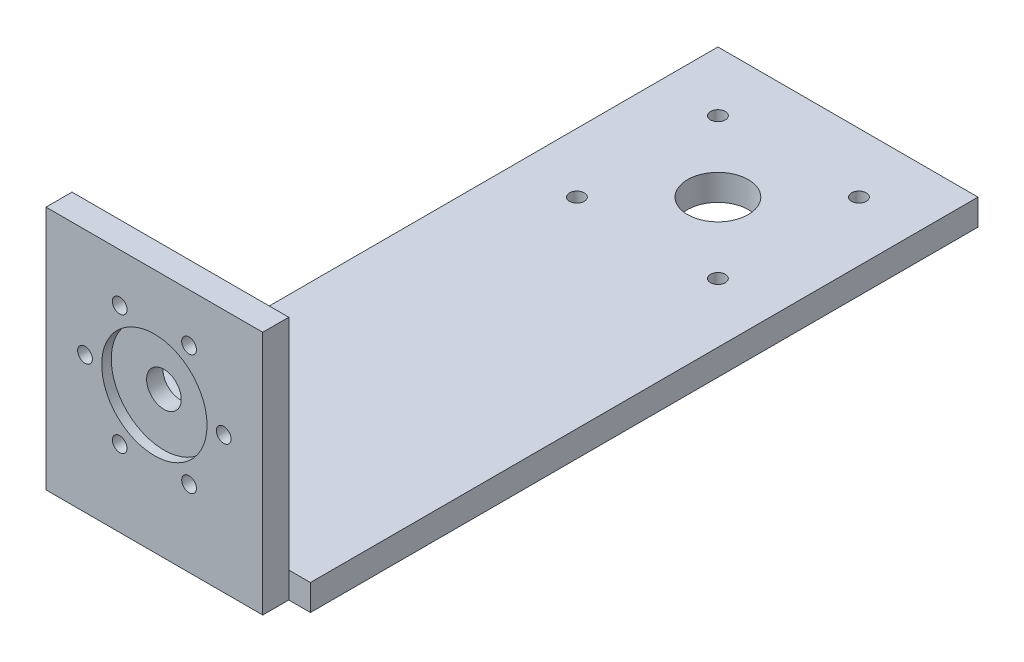
ISO-10303-21;
HEADER;
FILE_DESCRIPTION(('STEP AP214'),'2;1');
FILE_NAME('part.step','',(''),(''),'','','');
FILE_SCHEMA(('AUTOMOTIVE_DESIGN { 1 0 10303 214 1 1 1 1 }'));
ENDSEC;
DATA;
#1=APPLICATION_CONTEXT('core data for automotive mechanical design processes');
#2=APPLICATION_PROTOCOL_DEFINITION('international standard','automotive_design',2000,#1);
#3=PRODUCT_CONTEXT('',#1,'mechanical');
#4=PRODUCT('Part','Part','',(#3));
#5=PRODUCT_RELATED_PRODUCT_CATEGORY('part','',(#4));
#6=PRODUCT_DEFINITION_FORMATION('','',#4);
#7=PRODUCT_DEFINITION_CONTEXT('part definition',#1,'design');
#8=PRODUCT_DEFINITION('design','',#6,#7);
#9=PRODUCT_DEFINITION_SHAPE('','',#8);
#10=(LENGTH_UNIT() NAMED_UNIT(*) SI_UNIT(.MILLI.,.METRE.));
#11=(NAMED_UNIT(*) PLANE_ANGLE_UNIT() SI_UNIT($,.RADIAN.));
#12=(NAMED_UNIT(*) SI_UNIT($,.STERADIAN.) SOLID_ANGLE_UNIT());
#13=UNCERTAINTY_MEASURE_WITH_UNIT(LENGTH_MEASURE(1.E-05),#10,'distance_accuracy_value','');
#14=(GEOMETRIC_REPRESENTATION_CONTEXT(3) GLOBAL_UNCERTAINTY_ASSIGNED_CONTEXT((#13)) GLOBAL_UNIT_ASSIGNED_CONTEXT((#10,
#11,#12)) REPRESENTATION_CONTEXT('',''));
#15=CARTESIAN_POINT('',(0.,0.,0.));
#16=DIRECTION('',(0.,0.,1.));
#17=DIRECTION('',(1.,0.,0.));
#18=AXIS2_PLACEMENT_3D('',#15,#16,#17);
#19=CARTESIAN_POINT('',(0.,0.,-6.));
#20=DIRECTION('',(0.,0.,1.));
#21=DIRECTION('',(1.,0.,0.));
#22=AXIS2_PLACEMENT_3D('',#19,#20,#21);
#23=PLANE('',#22);
#24=CARTESIAN_POINT('',(0.,0.,-6.));
#25=DIRECTION('',(0.,0.,1.));
#26=DIRECTION('',(1.,0.,0.));
#27=AXIS2_PLACEMENT_3D('',#24,#25,#26);
#28=CIRCLE('',#27,4.);
#29=CARTESIAN_POINT('',(4.,0.,-6.));
#30=VERTEX_POINT('',#29);
#31=EDGE_CURVE('E161',#30,#30,#28,.T.);
#32=ORIENTED_EDGE('',*,*,#31,.T.);
#33=EDGE_LOOP('',(#32));
#34=FACE_BOUND('',#33,.T.);
#35=CARTESIAN_POINT('',(8.,-13.856406460551,-6.));
#36=DIRECTION('',(0.,0.,1.));
#37=DIRECTION('',(1.,0.,0.));
#38=AXIS2_PLACEMENT_3D('',#35,#36,#37);
#39=CIRCLE('',#38,1.7);
#40=CARTESIAN_POINT('',(9.7,-13.856406460551,-6.));
#41=VERTEX_POINT('',#40);
#42=EDGE_CURVE('E163',#41,#41,#39,.T.);
#43=ORIENTED_EDGE('',*,*,#42,.T.);
#44=EDGE_LOOP('',(#43));
#45=FACE_BOUND('',#44,.T.);
#46=CARTESIAN_POINT('',(-8.00000000000001,-13.856406460551,-6.));
#47=DIRECTION('',(0.,0.,1.));
#48=DIRECTION('',(1.,0.,0.));
#49=AXIS2_PLACEMENT_3D('',#46,#47,#48);
#50=CIRCLE('',#49,1.7);
#51=CARTESIAN_POINT('',(-6.30000000000001,-13.856406460551,-6.));
#52=VERTEX_POINT('',#51);
#53=EDGE_CURVE('E169',#52,#52,#50,.T.);
#54=ORIENTED_EDGE('',*,*,#53,.T.);
#55=EDGE_LOOP('',(#54));
#56=FACE_BOUND('',#55,.T.);
#57=CARTESIAN_POINT('',(-16.,0.,-6.));
#58=DIRECTION('',(0.,0.,1.));
#59=DIRECTION('',(1.,0.,0.));
#60=AXIS2_PLACEMENT_3D('',#57,#58,#59);
#61=CIRCLE('',#60,1.7);
#62=CARTESIAN_POINT('',(-14.3,0.,-6.));
#63=VERTEX_POINT('',#62);
#64=EDGE_CURVE('E173',#63,#63,#61,.T.);
#65=ORIENTED_EDGE('',*,*,#64,.T.);
#66=EDGE_LOOP('',(#65));
#67=FACE_BOUND('',#66,.T.);
#68=CARTESIAN_POINT('',(-8.,13.856406460551,-6.));
#69=DIRECTION('',(0.,0.,1.));
#70=DIRECTION('',(1.,0.,0.));
#71=AXIS2_PLACEMENT_3D('',#68,#69,#70);
#72=CIRCLE('',#71,1.7);
#73=CARTESIAN_POINT('',(-6.3,13.856406460551,-6.));
#74=VERTEX_POINT('',#73);
#75=EDGE_CURVE('E178',#74,#74,#72,.T.);
#76=ORIENTED_EDGE('',*,*,#75,.T.);
#77=EDGE_LOOP('',(#76));
#78=FACE_BOUND('',#77,.T.);
#79=CARTESIAN_POINT('',(8.,13.856406460551,-6.));
#80=DIRECTION('',(0.,0.,1.));
#81=DIRECTION('',(1.,0.,0.));
#82=AXIS2_PLACEMENT_3D('',#79,#80,#81);
#83=CIRCLE('',#82,1.7);
#84=CARTESIAN_POINT('',(9.7,13.856406460551,-6.));
#85=VERTEX_POINT('',#84);
#86=EDGE_CURVE('E189',#85,#85,#83,.T.);
#87=ORIENTED_EDGE('',*,*,#86,.T.);
#88=EDGE_LOOP('',(#87));
#89=FACE_BOUND('',#88,.T.);
#90=CARTESIAN_POINT('',(16.,0.,-6.));
#91=DIRECTION('',(0.,0.,1.));
#92=DIRECTION('',(1.,0.,0.));
#93=AXIS2_PLACEMENT_3D('',#90,#91,#92);
#94=CIRCLE('',#93,1.7);
#95=CARTESIAN_POINT('',(17.7,0.,-6.));
#96=VERTEX_POINT('',#95);
#97=EDGE_CURVE('E195',#96,#96,#94,.T.);
#98=ORIENTED_EDGE('',*,*,#97,.T.);
#99=EDGE_LOOP('',(#98));
#100=FACE_BOUND('',#99,.T.);
#101=DIRECTION('',(1.,0.,0.));
#102=VECTOR('',#101,1.);
#103=CARTESIAN_POINT('',(-30.,-25.5,-6.));
#104=LINE('',#103,#102);
#105=CARTESIAN_POINT('',(-25.,-25.5,-6.));
#106=VERTEX_POINT('',#105);
#107=CARTESIAN_POINT('',(25.,-25.5,-6.));
#108=VERTEX_POINT('',#107);
#109=EDGE_CURVE('E11',#106,#108,#104,.T.);
#110=ORIENTED_EDGE('',*,*,#109,.F.);
#111=DIRECTION('',(0.,-1.,0.));
#112=VECTOR('',#111,1.);
#113=CARTESIAN_POINT('',(-25.,25.,-6.));
#114=LINE('',#113,#112);
#115=CARTESIAN_POINT('',(-25.,25.,-6.));
#116=VERTEX_POINT('',#115);
#117=EDGE_CURVE('E210',#116,#106,#114,.T.);
#118=ORIENTED_EDGE('',*,*,#117,.F.);
#119=DIRECTION('',(-1.,0.,0.));
#120=VECTOR('',#119,1.);
#121=CARTESIAN_POINT('',(25.,25.,-6.));
#122=LINE('',#121,#120);
#123=CARTESIAN_POINT('',(25.,25.,-6.));
#124=VERTEX_POINT('',#123);
#125=EDGE_CURVE('E88',#124,#116,#122,.T.);
#126=ORIENTED_EDGE('',*,*,#125,.F.);
#127=DIRECTION('',(0.,1.,0.));
#128=VECTOR('',#127,1.);
#129=CARTESIAN_POINT('',(25.,-31.5,-6.));
#130=LINE('',#129,#128);
#131=EDGE_CURVE('E207',#108,#124,#130,.T.);
#132=ORIENTED_EDGE('',*,*,#131,.F.);
#133=EDGE_LOOP('',(#110,#118,#126,#132));
#134=FACE_BOUND('',#133,.T.);
#135=ADVANCED_FACE('F39',(#34,#45,#56,#67,#78,#89,#100,#134),#23,.F.);
#136=CARTESIAN_POINT('',(0.,0.,0.));
#137=DIRECTION('',(0.,0.,-1.));
#138=DIRECTION('',(-1.,0.,0.));
#139=AXIS2_PLACEMENT_3D('',#136,#137,#138);
#140=CYLINDRICAL_SURFACE('',#139,4.);
#141=ORIENTED_EDGE('',*,*,#31,.F.);
#142=EDGE_LOOP('',(#141));
#143=FACE_BOUND('',#142,.T.);
#144=CARTESIAN_POINT('',(0.,0.,-2.2));
#145=DIRECTION('',(0.,0.,1.));
#146=DIRECTION('',(1.,0.,0.));
#147=AXIS2_PLACEMENT_3D('',#144,#145,#146);
#148=CIRCLE('',#147,4.);
#149=CARTESIAN_POINT('',(4.,0.,-2.2));
#150=VERTEX_POINT('',#149);
#151=EDGE_CURVE('E43',#150,#150,#148,.T.);
#152=ORIENTED_EDGE('',*,*,#151,.T.);
#153=EDGE_LOOP('',(#152));
#154=FACE_BOUND('',#153,.T.);
#155=ADVANCED_FACE('F278',(#143,#154),#140,.F.);
#156=CARTESIAN_POINT('',(0.,0.,0.));
#157=DIRECTION('',(0.,0.,1.));
#158=DIRECTION('',(1.,0.,0.));
#159=AXIS2_PLACEMENT_3D('',#156,#157,#158);
#160=PLANE('',#159);
#161=CARTESIAN_POINT('',(0.,0.,0.));
#162=DIRECTION('',(0.,0.,1.));
#163=DIRECTION('',(1.,0.,0.));
#164=AXIS2_PLACEMENT_3D('',#161,#162,#163);
#165=CIRCLE('',#164,12.15);
#166=CARTESIAN_POINT('',(12.15,0.,0.));
#167=VERTEX_POINT('',#166);
#168=EDGE_CURVE('E146',#167,#167,#165,.T.);
#169=ORIENTED_EDGE('',*,*,#168,.F.);
#170=EDGE_LOOP('',(#169));
#171=FACE_BOUND('',#170,.T.);
#172=CARTESIAN_POINT('',(8.,-13.856406460551,0.));
#173=DIRECTION('',(0.,0.,1.));
#174=DIRECTION('',(1.,0.,0.));
#175=AXIS2_PLACEMENT_3D('',#172,#173,#174);
#176=CIRCLE('',#175,1.7);
#177=CARTESIAN_POINT('',(9.7,-13.856406460551,0.));
#178=VERTEX_POINT('',#177);
#179=EDGE_CURVE('E164',#178,#178,#176,.T.);
#180=ORIENTED_EDGE('',*,*,#179,.F.);
#181=EDGE_LOOP('',(#180));
#182=FACE_BOUND('',#181,.T.);
#183=CARTESIAN_POINT('',(-16.,0.,0.));
#184=DIRECTION('',(0.,0.,1.));
#185=DIRECTION('',(1.,0.,0.));
#186=AXIS2_PLACEMENT_3D('',#183,#184,#185);
#187=CIRCLE('',#186,1.7);
#188=CARTESIAN_POINT('',(-14.3,0.,0.));
#189=VERTEX_POINT('',#188);
#190=EDGE_CURVE('E180',#189,#189,#187,.T.);
#191=ORIENTED_EDGE('',*,*,#190,.F.);
#192=EDGE_LOOP('',(#191));
#193=FACE_BOUND('',#192,.T.);
#194=CARTESIAN_POINT('',(8.,13.856406460551,0.));
#195=DIRECTION('',(0.,0.,1.));
#196=DIRECTION('',(1.,0.,0.));
#197=AXIS2_PLACEMENT_3D('',#194,#195,#196);
#198=CIRCLE('',#197,1.7);
#199=CARTESIAN_POINT('',(9.7,13.856406460551,0.));
#200=VERTEX_POINT('',#199);
#201=EDGE_CURVE('E188',#200,#200,#198,.T.);
#202=ORIENTED_EDGE('',*,*,#201,.F.);
#203=EDGE_LOOP('',(#202));
#204=FACE_BOUND('',#203,.T.);
#205=DIRECTION('',(0.,-1.,0.));
#206=VECTOR('',#205,1.);
#207=CARTESIAN_POINT('',(-25.,25.,0.));
#208=LINE('',#207,#206);
#209=CARTESIAN_POINT('',(-25.,25.,0.));
#210=VERTEX_POINT('',#209);
#211=CARTESIAN_POINT('',(-25.,-31.5,0.));
#212=VERTEX_POINT('',#211);
#213=EDGE_CURVE('E199',#210,#212,#208,.T.);
#214=ORIENTED_EDGE('',*,*,#213,.T.);
#215=DIRECTION('',(1.,0.,0.));
#216=VECTOR('',#215,1.);
#217=CARTESIAN_POINT('',(-25.,-31.5,0.));
#218=LINE('',#217,#216);
#219=CARTESIAN_POINT('',(25.,-31.5,0.));
#220=VERTEX_POINT('',#219);
#221=EDGE_CURVE('E94',#212,#220,#218,.T.);
#222=ORIENTED_EDGE('',*,*,#221,.T.);
#223=DIRECTION('',(0.,1.,0.));
#224=VECTOR('',#223,1.);
#225=CARTESIAN_POINT('',(25.,-31.5,0.));
#226=LINE('',#225,#224);
#227=CARTESIAN_POINT('',(25.,25.,0.));
#228=VERTEX_POINT('',#227);
#229=EDGE_CURVE('E201',#220,#228,#226,.T.);
#230=ORIENTED_EDGE('',*,*,#229,.T.);
#231=DIRECTION('',(-1.,0.,0.));
#232=VECTOR('',#231,1.);
#233=CARTESIAN_POINT('',(25.,25.,0.));
#234=LINE('',#233,#232);
#235=EDGE_CURVE('E62',#228,#210,#234,.T.);
#236=ORIENTED_EDGE('',*,*,#235,.T.);
#237=EDGE_LOOP('',(#214,#222,#230,#236));
#238=FACE_BOUND('',#237,.T.);
#239=CARTESIAN_POINT('',(16.,0.,0.));
#240=DIRECTION('',(0.,0.,1.));
#241=DIRECTION('',(1.,0.,0.));
#242=AXIS2_PLACEMENT_3D('',#239,#240,#241);
#243=CIRCLE('',#242,1.7);
#244=CARTESIAN_POINT('',(17.7,0.,0.));
#245=VERTEX_POINT('',#244);
#246=EDGE_CURVE('E193',#245,#245,#243,.T.);
#247=ORIENTED_EDGE('',*,*,#246,.F.);
#248=EDGE_LOOP('',(#247));
#249=FACE_BOUND('',#248,.T.);
#250=CARTESIAN_POINT('',(-8.,13.856406460551,0.));
#251=DIRECTION('',(0.,0.,1.));
#252=DIRECTION('',(1.,0.,0.));
#253=AXIS2_PLACEMENT_3D('',#250,#251,#252);
#254=CIRCLE('',#253,1.7);
#255=CARTESIAN_POINT('',(-6.3,13.856406460551,0.));
#256=VERTEX_POINT('',#255);
#257=EDGE_CURVE('E181',#256,#256,#254,.T.);
#258=ORIENTED_EDGE('',*,*,#257,.F.);
#259=EDGE_LOOP('',(#258));
#260=FACE_BOUND('',#259,.T.);
#261=CARTESIAN_POINT('',(-8.00000000000001,-13.856406460551,0.));
#262=DIRECTION('',(0.,0.,1.));
#263=DIRECTION('',(1.,0.,0.));
#264=AXIS2_PLACEMENT_3D('',#261,#262,#263);
#265=CIRCLE('',#264,1.7);
#266=CARTESIAN_POINT('',(-6.30000000000001,-13.856406460551,0.));
#267=VERTEX_POINT('',#266);
#268=EDGE_CURVE('E174',#267,#267,#265,.T.);
#269=ORIENTED_EDGE('',*,*,#268,.F.);
#270=EDGE_LOOP('',(#269));
#271=FACE_BOUND('',#270,.T.);
#272=ADVANCED_FACE('F262',(#171,#182,#193,#204,#238,#249,#260,#271),#160,.T.);
#273=CARTESIAN_POINT('',(-25.,25.,0.));
#274=DIRECTION('',(1.,0.,0.));
#275=DIRECTION('',(0.,0.,-1.));
#276=AXIS2_PLACEMENT_3D('',#273,#274,#275);
#277=PLANE('',#276);
#278=ORIENTED_EDGE('',*,*,#117,.T.);
#279=CARTESIAN_POINT('',(-25.,-31.5,-6.));
#280=VERTEX_POINT('',#279);
#281=EDGE_CURVE('E134',#106,#280,#114,.T.);
#282=ORIENTED_EDGE('',*,*,#281,.T.);
#283=DIRECTION('',(0.,0.,-1.));
#284=VECTOR('',#283,1.);
#285=CARTESIAN_POINT('',(-25.,-31.5,0.));
#286=LINE('',#285,#284);
#287=EDGE_CURVE('E48',#212,#280,#286,.T.);
#288=ORIENTED_EDGE('',*,*,#287,.F.);
#289=ORIENTED_EDGE('',*,*,#213,.F.);
#290=DIRECTION('',(0.,0.,-1.));
#291=VECTOR('',#290,1.);
#292=CARTESIAN_POINT('',(-25.,25.,0.));
#293=LINE('',#292,#291);
#294=EDGE_CURVE('E206',#210,#116,#293,.T.);
#295=ORIENTED_EDGE('',*,*,#294,.T.);
#296=EDGE_LOOP('',(#278,#282,#288,#289,#295));
#297=FACE_BOUND('',#296,.T.);
#298=ADVANCED_FACE('F41',(#297),#277,.F.);
#299=CARTESIAN_POINT('',(-25.,-31.5,0.));
#300=DIRECTION('',(0.,1.,0.));
#301=DIRECTION('',(0.,0.,1.));
#302=AXIS2_PLACEMENT_3D('',#299,#300,#301);
#303=PLANE('',#302);
#304=ORIENTED_EDGE('',*,*,#287,.T.);
#305=DIRECTION('',(1.,0.,0.));
#306=VECTOR('',#305,1.);
#307=CARTESIAN_POINT('',(-30.,-31.5,-6.));
#308=LINE('',#307,#306);
#309=CARTESIAN_POINT('',(-30.,-31.5,-6.));
#310=VERTEX_POINT('',#309);
#311=EDGE_CURVE('E219',#310,#280,#308,.T.);
#312=ORIENTED_EDGE('',*,*,#311,.F.);
#313=DIRECTION('',(0.,0.,1.));
#314=VECTOR('',#313,1.);
#315=CARTESIAN_POINT('',(-30.,-31.5,-160.));
#316=LINE('',#315,#314);
#317=CARTESIAN_POINT('',(-30.,-31.5,-160.));
#318=VERTEX_POINT('',#317);
#319=EDGE_CURVE('E150',#318,#310,#316,.T.);
#320=ORIENTED_EDGE('',*,*,#319,.F.);
#321=DIRECTION('',(-1.,0.,0.));
#322=VECTOR('',#321,1.);
#323=CARTESIAN_POINT('',(30.,-31.5,-160.));
#324=LINE('',#323,#322);
#325=CARTESIAN_POINT('',(30.,-31.5,-160.));
#326=VERTEX_POINT('',#325);
#327=EDGE_CURVE('E141',#326,#318,#324,.T.);
#328=ORIENTED_EDGE('',*,*,#327,.F.);
#329=DIRECTION('',(0.,0.,-1.));
#330=VECTOR('',#329,1.);
#331=CARTESIAN_POINT('',(30.,-31.5,-6.));
#332=LINE('',#331,#330);
#333=CARTESIAN_POINT('',(30.,-31.5,-6.));
#334=VERTEX_POINT('',#333);
#335=EDGE_CURVE('E224',#334,#326,#332,.T.);
#336=ORIENTED_EDGE('',*,*,#335,.F.);
#337=CARTESIAN_POINT('',(25.,-31.5,-6.));
#338=VERTEX_POINT('',#337);
#339=EDGE_CURVE('E221',#338,#334,#308,.T.);
#340=ORIENTED_EDGE('',*,*,#339,.F.);
#341=DIRECTION('',(0.,0.,-1.));
#342=VECTOR('',#341,1.);
#343=CARTESIAN_POINT('',(25.,-31.5,0.));
#344=LINE('',#343,#342);
#345=EDGE_CURVE('E216',#220,#338,#344,.T.);
#346=ORIENTED_EDGE('',*,*,#345,.F.);
#347=ORIENTED_EDGE('',*,*,#221,.F.);
#348=EDGE_LOOP('',(#304,#312,#320,#328,#336,#340,#346,#347));
#349=FACE_BOUND('',#348,.T.);
#350=CARTESIAN_POINT('',(16.2634559672906,-31.5,-146.263455967291));
#351=DIRECTION('',(0.,1.,0.));
#352=DIRECTION('',(0.,0.,1.));
#353=AXIS2_PLACEMENT_3D('',#350,#351,#352);
#354=CIRCLE('',#353,1.7);
#355=CARTESIAN_POINT('',(16.2634559672906,-31.5,-144.563455967291));
#356=VERTEX_POINT('',#355);
#357=EDGE_CURVE('E245',#356,#356,#354,.T.);
#358=ORIENTED_EDGE('',*,*,#357,.T.);
#359=EDGE_LOOP('',(#358));
#360=FACE_BOUND('',#359,.T.);
#361=CARTESIAN_POINT('',(-16.2634559672906,-31.5,-146.263455967291));
#362=DIRECTION('',(0.,1.,0.));
#363=DIRECTION('',(0.,0.,1.));
#364=AXIS2_PLACEMENT_3D('',#361,#362,#363);
#365=CIRCLE('',#364,1.7);
#366=CARTESIAN_POINT('',(-16.2634559672906,-31.5,-144.563455967291));
#367=VERTEX_POINT('',#366);
#368=EDGE_CURVE('E253',#367,#367,#365,.T.);
#369=ORIENTED_EDGE('',*,*,#368,.T.);
#370=EDGE_LOOP('',(#369));
#371=FACE_BOUND('',#370,.T.);
#372=CARTESIAN_POINT('',(-16.2634559672906,-31.5,-113.736544032709));
#373=DIRECTION('',(0.,1.,0.));
#374=DIRECTION('',(0.,0.,1.));
#375=AXIS2_PLACEMENT_3D('',#372,#373,#374);
#376=CIRCLE('',#375,1.7);
#377=CARTESIAN_POINT('',(-16.2634559672906,-31.5,-112.036544032709));
#378=VERTEX_POINT('',#377);
#379=EDGE_CURVE('E368',#378,#378,#376,.T.);
#380=ORIENTED_EDGE('',*,*,#379,.T.);
#381=EDGE_LOOP('',(#380));
#382=FACE_BOUND('',#381,.T.);
#383=CARTESIAN_POINT('',(16.2634559672906,-31.5,-113.736544032709));
#384=DIRECTION('',(0.,1.,0.));
#385=DIRECTION('',(0.,0.,1.));
#386=AXIS2_PLACEMENT_3D('',#383,#384,#385);
#387=CIRCLE('',#386,1.7);
#388=CARTESIAN_POINT('',(16.2634559672906,-31.5,-112.036544032709));
#389=VERTEX_POINT('',#388);
#390=EDGE_CURVE('E358',#389,#389,#387,.T.);
#391=ORIENTED_EDGE('',*,*,#390,.T.);
#392=EDGE_LOOP('',(#391));
#393=FACE_BOUND('',#392,.T.);
#394=CARTESIAN_POINT('',(0.,-31.5,-130.));
#395=DIRECTION('',(0.,1.,0.));
#396=DIRECTION('',(0.,0.,1.));
#397=AXIS2_PLACEMENT_3D('',#394,#395,#396);
#398=CIRCLE('',#397,7.);
#399=CARTESIAN_POINT('',(0.,-31.5,-123.));
#400=VERTEX_POINT('',#399);
#401=EDGE_CURVE('E360',#400,#400,#398,.T.);
#402=ORIENTED_EDGE('',*,*,#401,.T.);
#403=EDGE_LOOP('',(#402));
#404=FACE_BOUND('',#403,.T.);
#405=ADVANCED_FACE('F217',(#349,#360,#371,#382,#393,#404),#303,.F.);
#406=CARTESIAN_POINT('',(25.,-31.5,0.));
#407=DIRECTION('',(-1.,0.,0.));
#408=DIRECTION('',(0.,0.,1.));
#409=AXIS2_PLACEMENT_3D('',#406,#407,#408);
#410=PLANE('',#409);
#411=EDGE_CURVE('E209',#338,#108,#130,.T.);
#412=ORIENTED_EDGE('',*,*,#411,.T.);
#413=ORIENTED_EDGE('',*,*,#131,.T.);
#414=DIRECTION('',(0.,0.,-1.));
#415=VECTOR('',#414,1.);
#416=CARTESIAN_POINT('',(25.,25.,0.));
#417=LINE('',#416,#415);
#418=EDGE_CURVE('E212',#228,#124,#417,.T.);
#419=ORIENTED_EDGE('',*,*,#418,.F.);
#420=ORIENTED_EDGE('',*,*,#229,.F.);
#421=ORIENTED_EDGE('',*,*,#345,.T.);
#422=EDGE_LOOP('',(#412,#413,#419,#420,#421));
#423=FACE_BOUND('',#422,.T.);
#424=ADVANCED_FACE('F263',(#423),#410,.F.);
#425=CARTESIAN_POINT('',(25.,25.,0.));
#426=DIRECTION('',(0.,-1.,0.));
#427=DIRECTION('',(0.,0.,-1.));
#428=AXIS2_PLACEMENT_3D('',#425,#426,#427);
#429=PLANE('',#428);
#430=ORIENTED_EDGE('',*,*,#125,.T.);
#431=ORIENTED_EDGE('',*,*,#294,.F.);
#432=ORIENTED_EDGE('',*,*,#235,.F.);
#433=ORIENTED_EDGE('',*,*,#418,.T.);
#434=EDGE_LOOP('',(#430,#431,#432,#433));
#435=FACE_BOUND('',#434,.T.);
#436=ADVANCED_FACE('F266',(#435),#429,.F.);
#437=CARTESIAN_POINT('',(16.,0.,0.));
#438=DIRECTION('',(0.,0.,-1.));
#439=DIRECTION('',(-1.,0.,0.));
#440=AXIS2_PLACEMENT_3D('',#437,#438,#439);
#441=CYLINDRICAL_SURFACE('',#440,1.7);
#442=ORIENTED_EDGE('',*,*,#246,.T.);
#443=EDGE_LOOP('',(#442));
#444=FACE_BOUND('',#443,.T.);
#445=ORIENTED_EDGE('',*,*,#97,.F.);
#446=EDGE_LOOP('',(#445));
#447=FACE_BOUND('',#446,.T.);
#448=ADVANCED_FACE('F268',(#444,#447),#441,.F.);
#449=CARTESIAN_POINT('',(8.,13.856406460551,0.));
#450=DIRECTION('',(0.,0.,-1.));
#451=DIRECTION('',(-1.,0.,0.));
#452=AXIS2_PLACEMENT_3D('',#449,#450,#451);
#453=CYLINDRICAL_SURFACE('',#452,1.7);
#454=ORIENTED_EDGE('',*,*,#201,.T.);
#455=EDGE_LOOP('',(#454));
#456=FACE_BOUND('',#455,.T.);
#457=ORIENTED_EDGE('',*,*,#86,.F.);
#458=EDGE_LOOP('',(#457));
#459=FACE_BOUND('',#458,.T.);
#460=ADVANCED_FACE('F272',(#456,#459),#453,.F.);
#461=CARTESIAN_POINT('',(-8.,13.856406460551,0.));
#462=DIRECTION('',(0.,0.,-1.));
#463=DIRECTION('',(-1.,0.,0.));
#464=AXIS2_PLACEMENT_3D('',#461,#462,#463);
#465=CYLINDRICAL_SURFACE('',#464,1.7);
#466=ORIENTED_EDGE('',*,*,#257,.T.);
#467=EDGE_LOOP('',(#466));
#468=FACE_BOUND('',#467,.T.);
#469=ORIENTED_EDGE('',*,*,#75,.F.);
#470=EDGE_LOOP('',(#469));
#471=FACE_BOUND('',#470,.T.);
#472=ADVANCED_FACE('F299',(#468,#471),#465,.F.);
#473=CARTESIAN_POINT('',(-16.,0.,0.));
#474=DIRECTION('',(0.,0.,-1.));
#475=DIRECTION('',(-1.,0.,0.));
#476=AXIS2_PLACEMENT_3D('',#473,#474,#475);
#477=CYLINDRICAL_SURFACE('',#476,1.7);
#478=ORIENTED_EDGE('',*,*,#190,.T.);
#479=EDGE_LOOP('',(#478));
#480=FACE_BOUND('',#479,.T.);
#481=ORIENTED_EDGE('',*,*,#64,.F.);
#482=EDGE_LOOP('',(#481));
#483=FACE_BOUND('',#482,.T.);
#484=ADVANCED_FACE('F297',(#480,#483),#477,.F.);
#485=CARTESIAN_POINT('',(-8.00000000000001,-13.856406460551,0.));
#486=DIRECTION('',(0.,0.,-1.));
#487=DIRECTION('',(-1.,0.,0.));
#488=AXIS2_PLACEMENT_3D('',#485,#486,#487);
#489=CYLINDRICAL_SURFACE('',#488,1.7);
#490=ORIENTED_EDGE('',*,*,#268,.T.);
#491=EDGE_LOOP('',(#490));
#492=FACE_BOUND('',#491,.T.);
#493=ORIENTED_EDGE('',*,*,#53,.F.);
#494=EDGE_LOOP('',(#493));
#495=FACE_BOUND('',#494,.T.);
#496=ADVANCED_FACE('F301',(#492,#495),#489,.F.);
#497=CARTESIAN_POINT('',(8.,-13.856406460551,0.));
#498=DIRECTION('',(0.,0.,-1.));
#499=DIRECTION('',(-1.,0.,0.));
#500=AXIS2_PLACEMENT_3D('',#497,#498,#499);
#501=CYLINDRICAL_SURFACE('',#500,1.7);
#502=ORIENTED_EDGE('',*,*,#179,.T.);
#503=EDGE_LOOP('',(#502));
#504=FACE_BOUND('',#503,.T.);
#505=ORIENTED_EDGE('',*,*,#42,.F.);
#506=EDGE_LOOP('',(#505));
#507=FACE_BOUND('',#506,.T.);
#508=ADVANCED_FACE('F306',(#504,#507),#501,.F.);
#509=CARTESIAN_POINT('',(0.,0.,-2.2));
#510=DIRECTION('',(0.,0.,1.));
#511=DIRECTION('',(1.,0.,0.));
#512=AXIS2_PLACEMENT_3D('',#509,#510,#511);
#513=CYLINDRICAL_SURFACE('',#512,12.15);
#514=CARTESIAN_POINT('',(0.,0.,-2.2));
#515=DIRECTION('',(0.,0.,1.));
#516=DIRECTION('',(1.,0.,0.));
#517=AXIS2_PLACEMENT_3D('',#514,#515,#516);
#518=CIRCLE('',#517,12.15);
#519=CARTESIAN_POINT('',(12.15,0.,-2.2));
#520=VERTEX_POINT('',#519);
#521=EDGE_CURVE('E155',#520,#520,#518,.T.);
#522=ORIENTED_EDGE('',*,*,#521,.F.);
#523=EDGE_LOOP('',(#522));
#524=FACE_BOUND('',#523,.T.);
#525=ORIENTED_EDGE('',*,*,#168,.T.);
#526=EDGE_LOOP('',(#525));
#527=FACE_BOUND('',#526,.T.);
#528=ADVANCED_FACE('F313',(#524,#527),#513,.F.);
#529=CARTESIAN_POINT('',(0.,0.,-2.2));
#530=DIRECTION('',(0.,0.,1.));
#531=DIRECTION('',(1.,0.,0.));
#532=AXIS2_PLACEMENT_3D('',#529,#530,#531);
#533=PLANE('',#532);
#534=ORIENTED_EDGE('',*,*,#151,.F.);
#535=EDGE_LOOP('',(#534));
#536=FACE_BOUND('',#535,.T.);
#537=ORIENTED_EDGE('',*,*,#521,.T.);
#538=EDGE_LOOP('',(#537));
#539=FACE_BOUND('',#538,.T.);
#540=ADVANCED_FACE('F316',(#536,#539),#533,.T.);
#541=CARTESIAN_POINT('',(-30.,-25.5,-6.));
#542=DIRECTION('',(0.,0.,-1.));
#543=DIRECTION('',(-1.,0.,0.));
#544=AXIS2_PLACEMENT_3D('',#541,#542,#543);
#545=PLANE('',#544);
#546=ORIENTED_EDGE('',*,*,#281,.F.);
#547=CARTESIAN_POINT('',(-30.,-25.5,-6.));
#548=VERTEX_POINT('',#547);
#549=EDGE_CURVE('E49',#548,#106,#104,.T.);
#550=ORIENTED_EDGE('',*,*,#549,.F.);
#551=DIRECTION('',(0.,-1.,0.));
#552=VECTOR('',#551,1.);
#553=CARTESIAN_POINT('',(-30.,-25.5,-6.));
#554=LINE('',#553,#552);
#555=EDGE_CURVE('E129',#548,#310,#554,.T.);
#556=ORIENTED_EDGE('',*,*,#555,.T.);
#557=ORIENTED_EDGE('',*,*,#311,.T.);
#558=EDGE_LOOP('',(#546,#550,#556,#557));
#559=FACE_BOUND('',#558,.T.);
#560=ADVANCED_FACE('F127',(#559),#545,.F.);
#561=CARTESIAN_POINT('',(0.,-25.5,0.));
#562=DIRECTION('',(0.,1.,0.));
#563=DIRECTION('',(0.,0.,1.));
#564=AXIS2_PLACEMENT_3D('',#561,#562,#563);
#565=PLANE('',#564);
#566=CARTESIAN_POINT('',(16.2634559672906,-25.5,-113.736544032709));
#567=DIRECTION('',(0.,1.,0.));
#568=DIRECTION('',(0.,0.,1.));
#569=AXIS2_PLACEMENT_3D('',#566,#567,#568);
#570=CIRCLE('',#569,1.7);
#571=CARTESIAN_POINT('',(16.2634559672906,-25.5,-112.036544032709));
#572=VERTEX_POINT('',#571);
#573=EDGE_CURVE('E361',#572,#572,#570,.T.);
#574=ORIENTED_EDGE('',*,*,#573,.F.);
#575=EDGE_LOOP('',(#574));
#576=FACE_BOUND('',#575,.T.);
#577=CARTESIAN_POINT('',(-16.2634559672906,-25.5,-146.263455967291));
#578=DIRECTION('',(0.,1.,0.));
#579=DIRECTION('',(0.,0.,1.));
#580=AXIS2_PLACEMENT_3D('',#577,#578,#579);
#581=CIRCLE('',#580,1.7);
#582=CARTESIAN_POINT('',(-16.2634559672906,-25.5,-144.563455967291));
#583=VERTEX_POINT('',#582);
#584=EDGE_CURVE('E249',#583,#583,#581,.T.);
#585=ORIENTED_EDGE('',*,*,#584,.F.);
#586=EDGE_LOOP('',(#585));
#587=FACE_BOUND('',#586,.T.);
#588=DIRECTION('',(0.,0.,1.));
#589=VECTOR('',#588,1.);
#590=CARTESIAN_POINT('',(-30.,-25.5,-160.));
#591=LINE('',#590,#589);
#592=CARTESIAN_POINT('',(-30.,-25.5,-160.));
#593=VERTEX_POINT('',#592);
#594=EDGE_CURVE('E132',#593,#548,#591,.T.);
#595=ORIENTED_EDGE('',*,*,#594,.T.);
#596=ORIENTED_EDGE('',*,*,#549,.T.);
#597=ORIENTED_EDGE('',*,*,#109,.T.);
#598=CARTESIAN_POINT('',(30.,-25.5,-6.));
#599=VERTEX_POINT('',#598);
#600=EDGE_CURVE('E51',#108,#599,#104,.T.);
#601=ORIENTED_EDGE('',*,*,#600,.T.);
#602=DIRECTION('',(0.,0.,-1.));
#603=VECTOR('',#602,1.);
#604=CARTESIAN_POINT('',(30.,-25.5,-6.));
#605=LINE('',#604,#603);
#606=CARTESIAN_POINT('',(30.,-25.5,-160.));
#607=VERTEX_POINT('',#606);
#608=EDGE_CURVE('E135',#599,#607,#605,.T.);
#609=ORIENTED_EDGE('',*,*,#608,.T.);
#610=DIRECTION('',(-1.,0.,0.));
#611=VECTOR('',#610,1.);
#612=CARTESIAN_POINT('',(30.,-25.5,-160.));
#613=LINE('',#612,#611);
#614=EDGE_CURVE('E136',#607,#593,#613,.T.);
#615=ORIENTED_EDGE('',*,*,#614,.T.);
#616=EDGE_LOOP('',(#595,#596,#597,#601,#609,#615));
#617=FACE_BOUND('',#616,.T.);
#618=CARTESIAN_POINT('',(16.2634559672906,-25.5,-146.263455967291));
#619=DIRECTION('',(0.,1.,0.));
#620=DIRECTION('',(0.,0.,1.));
#621=AXIS2_PLACEMENT_3D('',#618,#619,#620);
#622=CIRCLE('',#621,1.7);
#623=CARTESIAN_POINT('',(16.2634559672906,-25.5,-144.563455967291));
#624=VERTEX_POINT('',#623);
#625=EDGE_CURVE('E244',#624,#624,#622,.T.);
#626=ORIENTED_EDGE('',*,*,#625,.F.);
#627=EDGE_LOOP('',(#626));
#628=FACE_BOUND('',#627,.T.);
#629=CARTESIAN_POINT('',(-16.2634559672906,-25.5,-113.736544032709));
#630=DIRECTION('',(0.,1.,0.));
#631=DIRECTION('',(0.,0.,1.));
#632=AXIS2_PLACEMENT_3D('',#629,#630,#631);
#633=CIRCLE('',#632,1.7);
#634=CARTESIAN_POINT('',(-16.2634559672906,-25.5,-112.036544032709));
#635=VERTEX_POINT('',#634);
#636=EDGE_CURVE('E369',#635,#635,#633,.T.);
#637=ORIENTED_EDGE('',*,*,#636,.F.);
#638=EDGE_LOOP('',(#637));
#639=FACE_BOUND('',#638,.T.);
#640=CARTESIAN_POINT('',(0.,-25.5,-130.));
#641=DIRECTION('',(0.,1.,0.));
#642=DIRECTION('',(0.,0.,1.));
#643=AXIS2_PLACEMENT_3D('',#640,#641,#642);
#644=CIRCLE('',#643,7.);
#645=CARTESIAN_POINT('',(0.,-25.5,-123.));
#646=VERTEX_POINT('',#645);
#647=EDGE_CURVE('E353',#646,#646,#644,.T.);
#648=ORIENTED_EDGE('',*,*,#647,.F.);
#649=EDGE_LOOP('',(#648));
#650=FACE_BOUND('',#649,.T.);
#651=ADVANCED_FACE('F137',(#576,#587,#617,#628,#639,#650),#565,.T.);
#652=CARTESIAN_POINT('',(-30.,-25.5,-160.));
#653=DIRECTION('',(1.,0.,0.));
#654=DIRECTION('',(0.,0.,-1.));
#655=AXIS2_PLACEMENT_3D('',#652,#653,#654);
#656=PLANE('',#655);
#657=ORIENTED_EDGE('',*,*,#319,.T.);
#658=ORIENTED_EDGE('',*,*,#555,.F.);
#659=ORIENTED_EDGE('',*,*,#594,.F.);
#660=DIRECTION('',(0.,-1.,0.));
#661=VECTOR('',#660,1.);
#662=CARTESIAN_POINT('',(-30.,-25.5,-160.));
#663=LINE('',#662,#661);
#664=EDGE_CURVE('E232',#593,#318,#663,.T.);
#665=ORIENTED_EDGE('',*,*,#664,.T.);
#666=EDGE_LOOP('',(#657,#658,#659,#665));
#667=FACE_BOUND('',#666,.T.);
#668=ADVANCED_FACE('F144',(#667),#656,.F.);
#669=ORIENTED_EDGE('',*,*,#411,.F.);
#670=ORIENTED_EDGE('',*,*,#339,.T.);
#671=DIRECTION('',(0.,-1.,0.));
#672=VECTOR('',#671,1.);
#673=CARTESIAN_POINT('',(30.,-25.5,-6.));
#674=LINE('',#673,#672);
#675=EDGE_CURVE('E149',#599,#334,#674,.T.);
#676=ORIENTED_EDGE('',*,*,#675,.F.);
#677=ORIENTED_EDGE('',*,*,#600,.F.);
#678=EDGE_LOOP('',(#669,#670,#676,#677));
#679=FACE_BOUND('',#678,.T.);
#680=ADVANCED_FACE('F259',(#679),#545,.F.);
#681=CARTESIAN_POINT('',(30.,-25.5,-6.));
#682=DIRECTION('',(-1.,0.,0.));
#683=DIRECTION('',(0.,0.,1.));
#684=AXIS2_PLACEMENT_3D('',#681,#682,#683);
#685=PLANE('',#684);
#686=ORIENTED_EDGE('',*,*,#335,.T.);
#687=DIRECTION('',(0.,-1.,0.));
#688=VECTOR('',#687,1.);
#689=CARTESIAN_POINT('',(30.,-25.5,-160.));
#690=LINE('',#689,#688);
#691=EDGE_CURVE('E154',#607,#326,#690,.T.);
#692=ORIENTED_EDGE('',*,*,#691,.F.);
#693=ORIENTED_EDGE('',*,*,#608,.F.);
#694=ORIENTED_EDGE('',*,*,#675,.T.);
#695=EDGE_LOOP('',(#686,#692,#693,#694));
#696=FACE_BOUND('',#695,.T.);
#697=ADVANCED_FACE('F258',(#696),#685,.F.);
#698=CARTESIAN_POINT('',(30.,-25.5,-160.));
#699=DIRECTION('',(0.,0.,1.));
#700=DIRECTION('',(1.,0.,0.));
#701=AXIS2_PLACEMENT_3D('',#698,#699,#700);
#702=PLANE('',#701);
#703=ORIENTED_EDGE('',*,*,#327,.T.);
#704=ORIENTED_EDGE('',*,*,#664,.F.);
#705=ORIENTED_EDGE('',*,*,#614,.F.);
#706=ORIENTED_EDGE('',*,*,#691,.T.);
#707=EDGE_LOOP('',(#703,#704,#705,#706));
#708=FACE_BOUND('',#707,.T.);
#709=ADVANCED_FACE('F237',(#708),#702,.F.);
#710=CARTESIAN_POINT('',(16.2634559672906,-25.5,-146.263455967291));
#711=DIRECTION('',(0.,-1.,0.));
#712=DIRECTION('',(0.,0.,-1.));
#713=AXIS2_PLACEMENT_3D('',#710,#711,#712);
#714=CYLINDRICAL_SURFACE('',#713,1.7);
#715=ORIENTED_EDGE('',*,*,#625,.T.);
#716=EDGE_LOOP('',(#715));
#717=FACE_BOUND('',#716,.T.);
#718=ORIENTED_EDGE('',*,*,#357,.F.);
#719=EDGE_LOOP('',(#718));
#720=FACE_BOUND('',#719,.T.);
#721=ADVANCED_FACE('F327',(#717,#720),#714,.F.);
#722=CARTESIAN_POINT('',(-16.2634559672906,-25.5,-146.263455967291));
#723=DIRECTION('',(0.,-1.,0.));
#724=DIRECTION('',(0.,0.,-1.));
#725=AXIS2_PLACEMENT_3D('',#722,#723,#724);
#726=CYLINDRICAL_SURFACE('',#725,1.7);
#727=ORIENTED_EDGE('',*,*,#584,.T.);
#728=EDGE_LOOP('',(#727));
#729=FACE_BOUND('',#728,.T.);
#730=ORIENTED_EDGE('',*,*,#368,.F.);
#731=EDGE_LOOP('',(#730));
#732=FACE_BOUND('',#731,.T.);
#733=ADVANCED_FACE('F331',(#729,#732),#726,.F.);
#734=CARTESIAN_POINT('',(-16.2634559672906,-25.5,-113.736544032709));
#735=DIRECTION('',(0.,-1.,0.));
#736=DIRECTION('',(0.,0.,-1.));
#737=AXIS2_PLACEMENT_3D('',#734,#735,#736);
#738=CYLINDRICAL_SURFACE('',#737,1.7);
#739=ORIENTED_EDGE('',*,*,#636,.T.);
#740=EDGE_LOOP('',(#739));
#741=FACE_BOUND('',#740,.T.);
#742=ORIENTED_EDGE('',*,*,#379,.F.);
#743=EDGE_LOOP('',(#742));
#744=FACE_BOUND('',#743,.T.);
#745=ADVANCED_FACE('F336',(#741,#744),#738,.F.);
#746=CARTESIAN_POINT('',(16.2634559672906,-25.5,-113.736544032709));
#747=DIRECTION('',(0.,-1.,0.));
#748=DIRECTION('',(0.,0.,-1.));
#749=AXIS2_PLACEMENT_3D('',#746,#747,#748);
#750=CYLINDRICAL_SURFACE('',#749,1.7);
#751=ORIENTED_EDGE('',*,*,#573,.T.);
#752=EDGE_LOOP('',(#751));
#753=FACE_BOUND('',#752,.T.);
#754=ORIENTED_EDGE('',*,*,#390,.F.);
#755=EDGE_LOOP('',(#754));
#756=FACE_BOUND('',#755,.T.);
#757=ADVANCED_FACE('F342',(#753,#756),#750,.F.);
#758=CARTESIAN_POINT('',(0.,-25.5,-130.));
#759=DIRECTION('',(0.,-1.,0.));
#760=DIRECTION('',(0.,0.,-1.));
#761=AXIS2_PLACEMENT_3D('',#758,#759,#760);
#762=CYLINDRICAL_SURFACE('',#761,7.);
#763=ORIENTED_EDGE('',*,*,#647,.T.);
#764=EDGE_LOOP('',(#763));
#765=FACE_BOUND('',#764,.T.);
#766=ORIENTED_EDGE('',*,*,#401,.F.);
#767=EDGE_LOOP('',(#766));
#768=FACE_BOUND('',#767,.T.);
#769=ADVANCED_FACE('F343',(#765,#768),#762,.F.);
#770=CLOSED_SHELL('',(#135,#155,#272,#298,#405,#424,#436,#448,#460,#472,#484,#496,#508,#528,
#540,#560,#651,#668,#680,#697,#709,#721,#733,#745,#757,#769));
#771=MANIFOLD_SOLID_BREP('B2',#770);
#772=ADVANCED_BREP_SHAPE_REPRESENTATION('',(#18,#771),#14);
#773=SHAPE_DEFINITION_REPRESENTATION(#9,#772);
ENDSEC;
END-ISO-10303-21;
